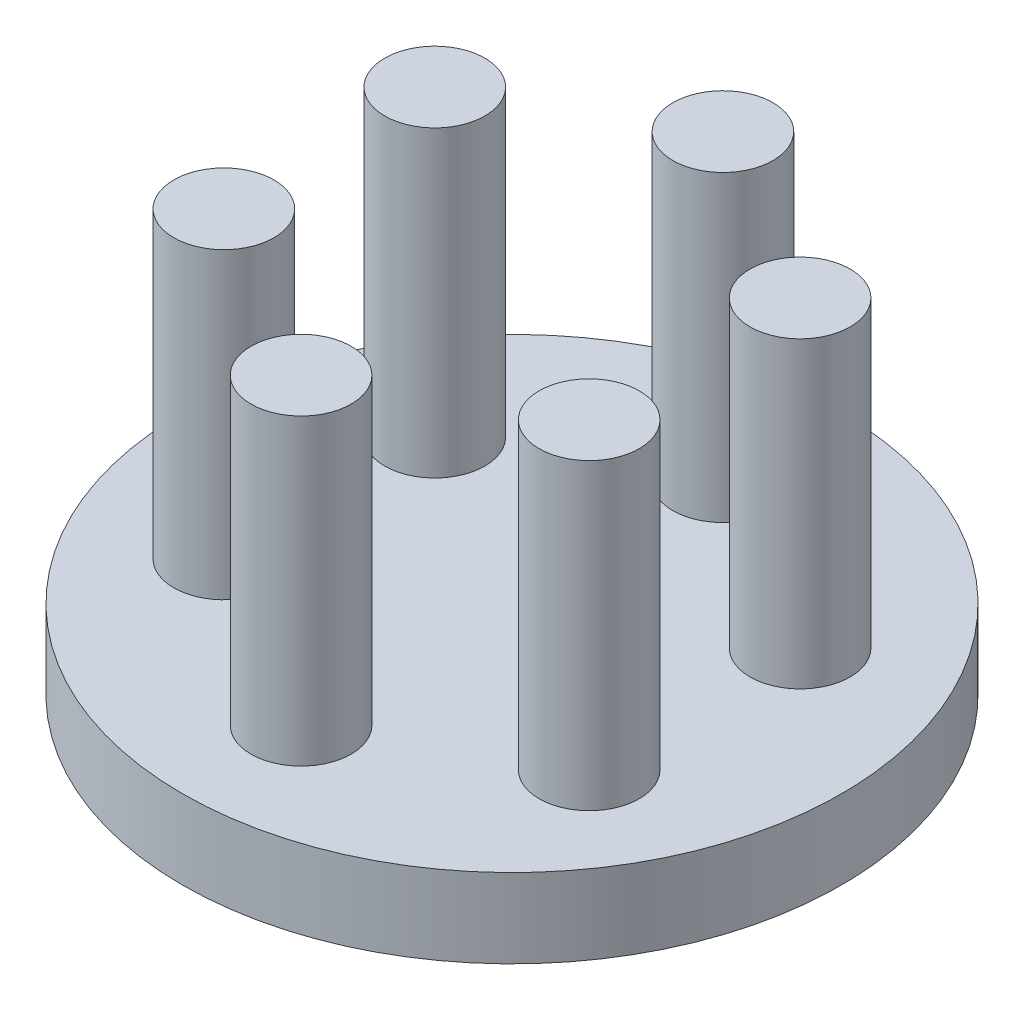
ISO-10303-21;
HEADER;
FILE_DESCRIPTION(('STEP AP214'),'2;1');
FILE_NAME('part.step','',(''),(''),'','','');
FILE_SCHEMA(('AUTOMOTIVE_DESIGN { 1 0 10303 214 1 1 1 1 }'));
ENDSEC;
DATA;
#1=APPLICATION_CONTEXT('core data for automotive mechanical design processes');
#2=APPLICATION_PROTOCOL_DEFINITION('international standard','automotive_design',2000,#1);
#3=PRODUCT_CONTEXT('',#1,'mechanical');
#4=PRODUCT('Part','Part','',(#3));
#5=PRODUCT_RELATED_PRODUCT_CATEGORY('part','',(#4));
#6=PRODUCT_DEFINITION_FORMATION('','',#4);
#7=PRODUCT_DEFINITION_CONTEXT('part definition',#1,'design');
#8=PRODUCT_DEFINITION('design','',#6,#7);
#9=PRODUCT_DEFINITION_SHAPE('','',#8);
#10=(LENGTH_UNIT() NAMED_UNIT(*) SI_UNIT(.MILLI.,.METRE.));
#11=(NAMED_UNIT(*) PLANE_ANGLE_UNIT() SI_UNIT($,.RADIAN.));
#12=(NAMED_UNIT(*) SI_UNIT($,.STERADIAN.) SOLID_ANGLE_UNIT());
#13=UNCERTAINTY_MEASURE_WITH_UNIT(LENGTH_MEASURE(1.E-05),#10,'distance_accuracy_value','');
#14=(GEOMETRIC_REPRESENTATION_CONTEXT(3) GLOBAL_UNCERTAINTY_ASSIGNED_CONTEXT((#13)) GLOBAL_UNIT_ASSIGNED_CONTEXT((#10,
#11,#12)) REPRESENTATION_CONTEXT('',''));
#15=CARTESIAN_POINT('',(0.,0.,0.));
#16=DIRECTION('',(0.,0.,1.));
#17=DIRECTION('',(1.,0.,0.));
#18=AXIS2_PLACEMENT_3D('',#15,#16,#17);
#19=CARTESIAN_POINT('',(0.,3.,0.));
#20=DIRECTION('',(0.,-1.,0.));
#21=DIRECTION('',(0.,0.,-1.));
#22=AXIS2_PLACEMENT_3D('',#19,#20,#21);
#23=CYLINDRICAL_SURFACE('',#22,12.5);
#24=CARTESIAN_POINT('',(0.,3.,0.));
#25=DIRECTION('',(0.,1.,0.));
#26=DIRECTION('',(0.,0.,1.));
#27=AXIS2_PLACEMENT_3D('',#24,#25,#26);
#28=CIRCLE('',#27,12.5);
#29=CARTESIAN_POINT('',(0.,3.,12.5));
#30=VERTEX_POINT('',#29);
#31=EDGE_CURVE('E10',#30,#30,#28,.T.);
#32=ORIENTED_EDGE('',*,*,#31,.F.);
#33=EDGE_LOOP('',(#32));
#34=FACE_BOUND('',#33,.T.);
#35=CARTESIAN_POINT('',(0.,0.,0.));
#36=DIRECTION('',(0.,1.,0.));
#37=DIRECTION('',(0.,0.,1.));
#38=AXIS2_PLACEMENT_3D('',#35,#36,#37);
#39=CIRCLE('',#38,12.5);
#40=CARTESIAN_POINT('',(0.,0.,12.5));
#41=VERTEX_POINT('',#40);
#42=EDGE_CURVE('E40',#41,#41,#39,.T.);
#43=ORIENTED_EDGE('',*,*,#42,.T.);
#44=EDGE_LOOP('',(#43));
#45=FACE_BOUND('',#44,.T.);
#46=ADVANCED_FACE('F37',(#34,#45),#23,.T.);
#47=CARTESIAN_POINT('',(0.,3.,0.));
#48=DIRECTION('',(0.,1.,0.));
#49=DIRECTION('',(0.,0.,1.));
#50=AXIS2_PLACEMENT_3D('',#47,#48,#49);
#51=PLANE('',#50);
#52=CARTESIAN_POINT('',(-6.92820323027551,3.,-4.));
#53=DIRECTION('',(0.,1.,0.));
#54=DIRECTION('',(0.,0.,1.));
#55=AXIS2_PLACEMENT_3D('',#52,#53,#54);
#56=CIRCLE('',#55,1.9);
#57=CARTESIAN_POINT('',(-6.92820323027551,3.,-2.1));
#58=VERTEX_POINT('',#57);
#59=EDGE_CURVE('E91',#58,#58,#56,.T.);
#60=ORIENTED_EDGE('',*,*,#59,.F.);
#61=EDGE_LOOP('',(#60));
#62=FACE_BOUND('',#61,.T.);
#63=CARTESIAN_POINT('',(0.,3.,8.));
#64=DIRECTION('',(0.,1.,0.));
#65=DIRECTION('',(0.,0.,1.));
#66=AXIS2_PLACEMENT_3D('',#63,#64,#65);
#67=CIRCLE('',#66,1.9);
#68=CARTESIAN_POINT('',(0.,3.,9.9));
#69=VERTEX_POINT('',#68);
#70=EDGE_CURVE('E83',#69,#69,#67,.T.);
#71=ORIENTED_EDGE('',*,*,#70,.F.);
#72=EDGE_LOOP('',(#71));
#73=FACE_BOUND('',#72,.T.);
#74=CARTESIAN_POINT('',(-6.92820323027551,3.,4.));
#75=DIRECTION('',(0.,1.,0.));
#76=DIRECTION('',(0.,0.,1.));
#77=AXIS2_PLACEMENT_3D('',#74,#75,#76);
#78=CIRCLE('',#77,1.9);
#79=CARTESIAN_POINT('',(-6.92820323027551,3.,5.9));
#80=VERTEX_POINT('',#79);
#81=EDGE_CURVE('E75',#80,#80,#78,.T.);
#82=ORIENTED_EDGE('',*,*,#81,.F.);
#83=EDGE_LOOP('',(#82));
#84=FACE_BOUND('',#83,.T.);
#85=CARTESIAN_POINT('',(6.92820323027551,3.,4.));
#86=DIRECTION('',(0.,1.,0.));
#87=DIRECTION('',(0.,0.,1.));
#88=AXIS2_PLACEMENT_3D('',#85,#86,#87);
#89=CIRCLE('',#88,1.9);
#90=CARTESIAN_POINT('',(6.92820323027551,3.,5.9));
#91=VERTEX_POINT('',#90);
#92=EDGE_CURVE('E67',#91,#91,#89,.T.);
#93=ORIENTED_EDGE('',*,*,#92,.F.);
#94=EDGE_LOOP('',(#93));
#95=FACE_BOUND('',#94,.T.);
#96=CARTESIAN_POINT('',(6.92820323027551,3.,-4.));
#97=DIRECTION('',(0.,1.,0.));
#98=DIRECTION('',(0.,0.,1.));
#99=AXIS2_PLACEMENT_3D('',#96,#97,#98);
#100=CIRCLE('',#99,1.9);
#101=CARTESIAN_POINT('',(6.92820323027551,3.,-2.1));
#102=VERTEX_POINT('',#101);
#103=EDGE_CURVE('E59',#102,#102,#100,.T.);
#104=ORIENTED_EDGE('',*,*,#103,.F.);
#105=EDGE_LOOP('',(#104));
#106=FACE_BOUND('',#105,.T.);
#107=CARTESIAN_POINT('',(0.,3.,-8.));
#108=DIRECTION('',(0.,1.,0.));
#109=DIRECTION('',(0.,0.,1.));
#110=AXIS2_PLACEMENT_3D('',#107,#108,#109);
#111=CIRCLE('',#110,1.9);
#112=CARTESIAN_POINT('',(0.,3.,-6.1));
#113=VERTEX_POINT('',#112);
#114=EDGE_CURVE('E51',#113,#113,#111,.T.);
#115=ORIENTED_EDGE('',*,*,#114,.F.);
#116=EDGE_LOOP('',(#115));
#117=FACE_BOUND('',#116,.T.);
#118=ORIENTED_EDGE('',*,*,#31,.T.);
#119=EDGE_LOOP('',(#118));
#120=FACE_BOUND('',#119,.T.);
#121=ADVANCED_FACE('F108',(#62,#73,#84,#95,#106,#117,#120),#51,.T.);
#122=CARTESIAN_POINT('',(0.,0.,0.));
#123=DIRECTION('',(0.,1.,0.));
#124=DIRECTION('',(0.,0.,1.));
#125=AXIS2_PLACEMENT_3D('',#122,#123,#124);
#126=PLANE('',#125);
#127=ORIENTED_EDGE('',*,*,#42,.F.);
#128=EDGE_LOOP('',(#127));
#129=FACE_BOUND('',#128,.T.);
#130=ADVANCED_FACE('F111',(#129),#126,.F.);
#131=CARTESIAN_POINT('',(0.,14.5,-8.));
#132=DIRECTION('',(0.,-1.,0.));
#133=DIRECTION('',(0.,0.,-1.));
#134=AXIS2_PLACEMENT_3D('',#131,#132,#133);
#135=CYLINDRICAL_SURFACE('',#134,1.9);
#136=CARTESIAN_POINT('',(0.,14.5,-8.));
#137=DIRECTION('',(0.,1.,0.));
#138=DIRECTION('',(0.,0.,1.));
#139=AXIS2_PLACEMENT_3D('',#136,#137,#138);
#140=CIRCLE('',#139,1.9);
#141=CARTESIAN_POINT('',(0.,14.5,-6.1));
#142=VERTEX_POINT('',#141);
#143=EDGE_CURVE('E49',#142,#142,#140,.T.);
#144=ORIENTED_EDGE('',*,*,#143,.F.);
#145=EDGE_LOOP('',(#144));
#146=FACE_BOUND('',#145,.T.);
#147=ORIENTED_EDGE('',*,*,#114,.T.);
#148=EDGE_LOOP('',(#147));
#149=FACE_BOUND('',#148,.T.);
#150=ADVANCED_FACE('F123',(#146,#149),#135,.T.);
#151=CARTESIAN_POINT('',(0.,14.5,-8.));
#152=DIRECTION('',(0.,1.,0.));
#153=DIRECTION('',(0.,0.,1.));
#154=AXIS2_PLACEMENT_3D('',#151,#152,#153);
#155=PLANE('',#154);
#156=ORIENTED_EDGE('',*,*,#143,.T.);
#157=EDGE_LOOP('',(#156));
#158=FACE_BOUND('',#157,.T.);
#159=ADVANCED_FACE('F125',(#158),#155,.T.);
#160=CARTESIAN_POINT('',(6.92820323027551,14.5,-4.));
#161=DIRECTION('',(0.,-1.,0.));
#162=DIRECTION('',(0.,0.,-1.));
#163=AXIS2_PLACEMENT_3D('',#160,#161,#162);
#164=CYLINDRICAL_SURFACE('',#163,1.9);
#165=CARTESIAN_POINT('',(6.92820323027551,14.5,-4.));
#166=DIRECTION('',(0.,1.,0.));
#167=DIRECTION('',(0.,0.,1.));
#168=AXIS2_PLACEMENT_3D('',#165,#166,#167);
#169=CIRCLE('',#168,1.9);
#170=CARTESIAN_POINT('',(6.92820323027551,14.5,-2.1));
#171=VERTEX_POINT('',#170);
#172=EDGE_CURVE('E55',#171,#171,#169,.T.);
#173=ORIENTED_EDGE('',*,*,#172,.F.);
#174=EDGE_LOOP('',(#173));
#175=FACE_BOUND('',#174,.T.);
#176=ORIENTED_EDGE('',*,*,#103,.T.);
#177=EDGE_LOOP('',(#176));
#178=FACE_BOUND('',#177,.T.);
#179=ADVANCED_FACE('F132',(#175,#178),#164,.T.);
#180=CARTESIAN_POINT('',(6.92820323027551,14.5,-4.));
#181=DIRECTION('',(0.,1.,0.));
#182=DIRECTION('',(0.,0.,1.));
#183=AXIS2_PLACEMENT_3D('',#180,#181,#182);
#184=PLANE('',#183);
#185=ORIENTED_EDGE('',*,*,#172,.T.);
#186=EDGE_LOOP('',(#185));
#187=FACE_BOUND('',#186,.T.);
#188=ADVANCED_FACE('F172',(#187),#184,.T.);
#189=CARTESIAN_POINT('',(6.92820323027551,14.5,4.));
#190=DIRECTION('',(0.,-1.,0.));
#191=DIRECTION('',(0.,0.,-1.));
#192=AXIS2_PLACEMENT_3D('',#189,#190,#191);
#193=CYLINDRICAL_SURFACE('',#192,1.9);
#194=CARTESIAN_POINT('',(6.92820323027551,14.5,4.));
#195=DIRECTION('',(0.,1.,0.));
#196=DIRECTION('',(0.,0.,1.));
#197=AXIS2_PLACEMENT_3D('',#194,#195,#196);
#198=CIRCLE('',#197,1.9);
#199=CARTESIAN_POINT('',(6.92820323027551,14.5,5.9));
#200=VERTEX_POINT('',#199);
#201=EDGE_CURVE('E63',#200,#200,#198,.T.);
#202=ORIENTED_EDGE('',*,*,#201,.F.);
#203=EDGE_LOOP('',(#202));
#204=FACE_BOUND('',#203,.T.);
#205=ORIENTED_EDGE('',*,*,#92,.T.);
#206=EDGE_LOOP('',(#205));
#207=FACE_BOUND('',#206,.T.);
#208=ADVANCED_FACE('F181',(#204,#207),#193,.T.);
#209=CARTESIAN_POINT('',(6.92820323027551,14.5,4.));
#210=DIRECTION('',(0.,1.,0.));
#211=DIRECTION('',(0.,0.,1.));
#212=AXIS2_PLACEMENT_3D('',#209,#210,#211);
#213=PLANE('',#212);
#214=ORIENTED_EDGE('',*,*,#201,.T.);
#215=EDGE_LOOP('',(#214));
#216=FACE_BOUND('',#215,.T.);
#217=ADVANCED_FACE('F190',(#216),#213,.T.);
#218=CARTESIAN_POINT('',(-6.92820323027551,14.5,4.));
#219=DIRECTION('',(0.,-1.,0.));
#220=DIRECTION('',(0.,0.,-1.));
#221=AXIS2_PLACEMENT_3D('',#218,#219,#220);
#222=CYLINDRICAL_SURFACE('',#221,1.9);
#223=CARTESIAN_POINT('',(-6.92820323027551,14.5,4.));
#224=DIRECTION('',(0.,1.,0.));
#225=DIRECTION('',(0.,0.,1.));
#226=AXIS2_PLACEMENT_3D('',#223,#224,#225);
#227=CIRCLE('',#226,1.9);
#228=CARTESIAN_POINT('',(-6.92820323027551,14.5,5.9));
#229=VERTEX_POINT('',#228);
#230=EDGE_CURVE('E71',#229,#229,#227,.T.);
#231=ORIENTED_EDGE('',*,*,#230,.F.);
#232=EDGE_LOOP('',(#231));
#233=FACE_BOUND('',#232,.T.);
#234=ORIENTED_EDGE('',*,*,#81,.T.);
#235=EDGE_LOOP('',(#234));
#236=FACE_BOUND('',#235,.T.);
#237=ADVANCED_FACE('F199',(#233,#236),#222,.T.);
#238=CARTESIAN_POINT('',(-6.92820323027551,14.5,4.));
#239=DIRECTION('',(0.,1.,0.));
#240=DIRECTION('',(0.,0.,1.));
#241=AXIS2_PLACEMENT_3D('',#238,#239,#240);
#242=PLANE('',#241);
#243=ORIENTED_EDGE('',*,*,#230,.T.);
#244=EDGE_LOOP('',(#243));
#245=FACE_BOUND('',#244,.T.);
#246=ADVANCED_FACE('F208',(#245),#242,.T.);
#247=CARTESIAN_POINT('',(0.,14.5,8.));
#248=DIRECTION('',(0.,-1.,0.));
#249=DIRECTION('',(0.,0.,-1.));
#250=AXIS2_PLACEMENT_3D('',#247,#248,#249);
#251=CYLINDRICAL_SURFACE('',#250,1.9);
#252=CARTESIAN_POINT('',(0.,14.5,8.));
#253=DIRECTION('',(0.,1.,0.));
#254=DIRECTION('',(0.,0.,1.));
#255=AXIS2_PLACEMENT_3D('',#252,#253,#254);
#256=CIRCLE('',#255,1.9);
#257=CARTESIAN_POINT('',(0.,14.5,9.9));
#258=VERTEX_POINT('',#257);
#259=EDGE_CURVE('E79',#258,#258,#256,.T.);
#260=ORIENTED_EDGE('',*,*,#259,.F.);
#261=EDGE_LOOP('',(#260));
#262=FACE_BOUND('',#261,.T.);
#263=ORIENTED_EDGE('',*,*,#70,.T.);
#264=EDGE_LOOP('',(#263));
#265=FACE_BOUND('',#264,.T.);
#266=ADVANCED_FACE('F217',(#262,#265),#251,.T.);
#267=CARTESIAN_POINT('',(0.,14.5,8.));
#268=DIRECTION('',(0.,1.,0.));
#269=DIRECTION('',(0.,0.,1.));
#270=AXIS2_PLACEMENT_3D('',#267,#268,#269);
#271=PLANE('',#270);
#272=ORIENTED_EDGE('',*,*,#259,.T.);
#273=EDGE_LOOP('',(#272));
#274=FACE_BOUND('',#273,.T.);
#275=ADVANCED_FACE('F104',(#274),#271,.T.);
#276=CARTESIAN_POINT('',(-6.92820323027551,14.5,-4.));
#277=DIRECTION('',(0.,-1.,0.));
#278=DIRECTION('',(0.,0.,-1.));
#279=AXIS2_PLACEMENT_3D('',#276,#277,#278);
#280=CYLINDRICAL_SURFACE('',#279,1.9);
#281=CARTESIAN_POINT('',(-6.92820323027551,14.5,-4.));
#282=DIRECTION('',(0.,1.,0.));
#283=DIRECTION('',(0.,0.,1.));
#284=AXIS2_PLACEMENT_3D('',#281,#282,#283);
#285=CIRCLE('',#284,1.9);
#286=CARTESIAN_POINT('',(-6.92820323027551,14.5,-2.1));
#287=VERTEX_POINT('',#286);
#288=EDGE_CURVE('E87',#287,#287,#285,.T.);
#289=ORIENTED_EDGE('',*,*,#288,.F.);
#290=EDGE_LOOP('',(#289));
#291=FACE_BOUND('',#290,.T.);
#292=ORIENTED_EDGE('',*,*,#59,.T.);
#293=EDGE_LOOP('',(#292));
#294=FACE_BOUND('',#293,.T.);
#295=ADVANCED_FACE('F101',(#291,#294),#280,.T.);
#296=CARTESIAN_POINT('',(-6.92820323027551,14.5,-4.));
#297=DIRECTION('',(0.,1.,0.));
#298=DIRECTION('',(0.,0.,1.));
#299=AXIS2_PLACEMENT_3D('',#296,#297,#298);
#300=PLANE('',#299);
#301=ORIENTED_EDGE('',*,*,#288,.T.);
#302=EDGE_LOOP('',(#301));
#303=FACE_BOUND('',#302,.T.);
#304=ADVANCED_FACE('F99',(#303),#300,.T.);
#305=CLOSED_SHELL('',(#46,#121,#130,#150,#159,#179,#188,#208,#217,#237,#246,#266,#275,#295,#304));
#306=MANIFOLD_SOLID_BREP('B2',#305);
#307=ADVANCED_BREP_SHAPE_REPRESENTATION('',(#18,#306),#14);
#308=SHAPE_DEFINITION_REPRESENTATION(#9,#307);
ENDSEC;
END-ISO-10303-21;
